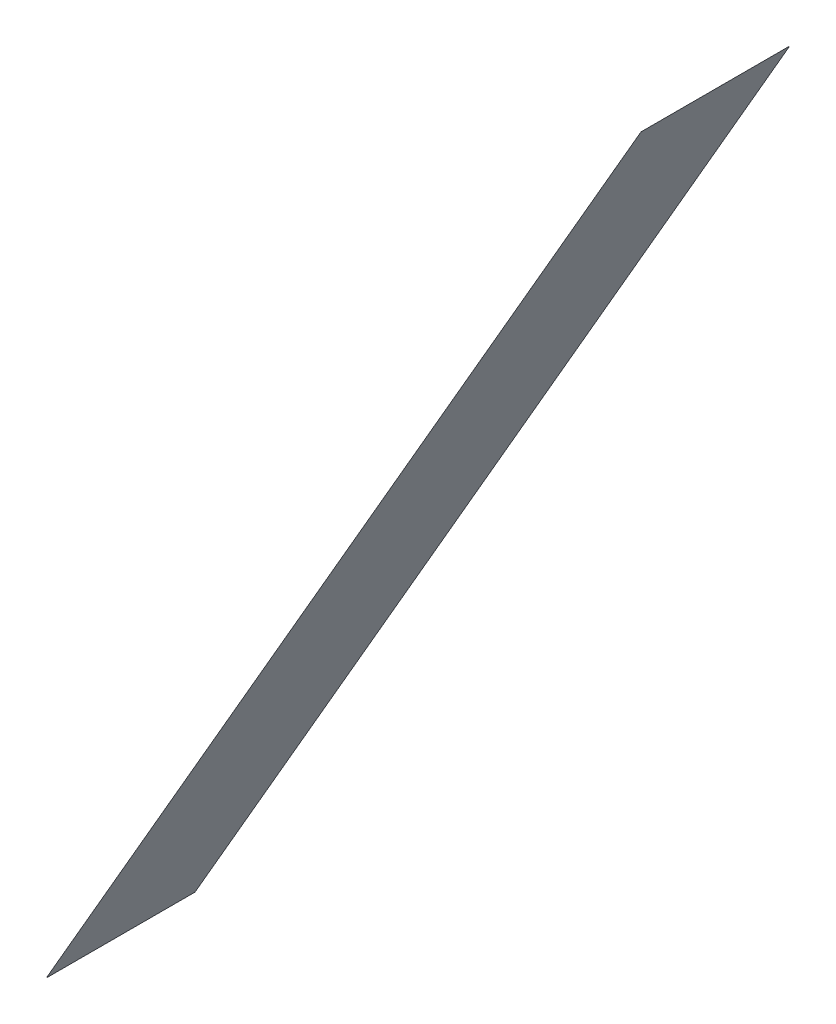
ISO-10303-21;
HEADER;
FILE_DESCRIPTION(('STEP AP214'),'2;1');
FILE_NAME('part.step','',(''),(''),'','','');
FILE_SCHEMA(('AUTOMOTIVE_DESIGN { 1 0 10303 214 1 1 1 1 }'));
ENDSEC;
DATA;
#1=APPLICATION_CONTEXT('core data for automotive mechanical design processes');
#2=APPLICATION_PROTOCOL_DEFINITION('international standard','automotive_design',2000,#1);
#3=PRODUCT_CONTEXT('',#1,'mechanical');
#4=PRODUCT('Part','Part','',(#3));
#5=PRODUCT_RELATED_PRODUCT_CATEGORY('part','',(#4));
#6=PRODUCT_DEFINITION_FORMATION('','',#4);
#7=PRODUCT_DEFINITION_CONTEXT('part definition',#1,'design');
#8=PRODUCT_DEFINITION('design','',#6,#7);
#9=PRODUCT_DEFINITION_SHAPE('','',#8);
#10=(LENGTH_UNIT() NAMED_UNIT(*) SI_UNIT(.MILLI.,.METRE.));
#11=(NAMED_UNIT(*) PLANE_ANGLE_UNIT() SI_UNIT($,.RADIAN.));
#12=(NAMED_UNIT(*) SI_UNIT($,.STERADIAN.) SOLID_ANGLE_UNIT());
#13=UNCERTAINTY_MEASURE_WITH_UNIT(LENGTH_MEASURE(1.E-05),#10,'distance_accuracy_value','');
#14=(GEOMETRIC_REPRESENTATION_CONTEXT(3) GLOBAL_UNCERTAINTY_ASSIGNED_CONTEXT((#13)) GLOBAL_UNIT_ASSIGNED_CONTEXT((#10,
#11,#12)) REPRESENTATION_CONTEXT('',''));
#15=CARTESIAN_POINT('',(0.,0.,0.));
#16=DIRECTION('',(0.,0.,1.));
#17=DIRECTION('',(1.,0.,0.));
#18=AXIS2_PLACEMENT_3D('',#15,#16,#17);
#19=CARTESIAN_POINT('',(198.075577351083,41.076959417664,-265.));
#20=DIRECTION('',(0.,0.,1.));
#21=DIRECTION('',(1.,0.,0.));
#22=AXIS2_PLACEMENT_3D('',#19,#20,#21);
#23=PLANE('',#22);
#24=DIRECTION('',(-0.499999988947861,-0.866025410165394,0.));
#25=VECTOR('',#24,1.);
#26=CARTESIAN_POINT('',(161.247322967488,-14.7115485985014,-265.));
#27=LINE('',#26,#25);
#28=CARTESIAN_POINT('',(204.611518195468,60.3974429793359,-265.));
#29=VERTEX_POINT('',#28);
#30=CARTESIAN_POINT('',(184.611518637553,25.7564265727202,-265.));
#31=VERTEX_POINT('',#30);
#32=EDGE_CURVE('E122',#29,#31,#27,.T.);
#33=ORIENTED_EDGE('',*,*,#32,.T.);
#34=DIRECTION('',(0.866025403784439,-0.5,0.));
#35=VECTOR('',#34,1.);
#36=CARTESIAN_POINT('',(184.611477608081,25.756450261097,-265.));
#37=LINE('',#36,#35);
#38=CARTESIAN_POINT('',(184.611477608081,25.756450261097,-265.));
#39=VERTEX_POINT('',#38);
#40=EDGE_CURVE('E115',#39,#31,#37,.T.);
#41=ORIENTED_EDGE('',*,*,#40,.F.);
#42=DIRECTION('',(-0.5,-0.866025403784439,0.));
#43=VECTOR('',#42,1.);
#44=CARTESIAN_POINT('',(204.611477608081,60.3974664124746,-265.));
#45=LINE('',#44,#43);
#46=CARTESIAN_POINT('',(204.611477608081,60.3974664124746,-265.));
#47=VERTEX_POINT('',#46);
#48=EDGE_CURVE('E106',#47,#39,#45,.T.);
#49=ORIENTED_EDGE('',*,*,#48,.F.);
#50=DIRECTION('',(-0.866025403784439,0.5,0.));
#51=VECTOR('',#50,1.);
#52=CARTESIAN_POINT('',(211.539677094085,56.397468574231,-265.));
#53=LINE('',#52,#51);
#54=EDGE_CURVE('E56',#29,#47,#53,.T.);
#55=ORIENTED_EDGE('',*,*,#54,.F.);
#56=EDGE_LOOP('',(#33,#41,#49,#55));
#57=FACE_BOUND('',#56,.T.);
#58=ADVANCED_FACE('F48',(#57),#23,.F.);
#59=CARTESIAN_POINT('',(198.075577351083,41.076959417664,-260.));
#60=DIRECTION('',(0.,0.,1.));
#61=DIRECTION('',(1.,0.,0.));
#62=AXIS2_PLACEMENT_3D('',#59,#60,#61);
#63=PLANE('',#62);
#64=DIRECTION('',(-0.499999988947861,-0.866025410165394,0.));
#65=VECTOR('',#64,1.);
#66=CARTESIAN_POINT('',(172.179452182066,4.22345519411566,-260.));
#67=LINE('',#66,#65);
#68=CARTESIAN_POINT('',(204.611518195468,60.3974429793359,-260.));
#69=VERTEX_POINT('',#68);
#70=CARTESIAN_POINT('',(184.611518637553,25.7564265727202,-260.));
#71=VERTEX_POINT('',#70);
#72=EDGE_CURVE('E143',#69,#71,#67,.T.);
#73=ORIENTED_EDGE('',*,*,#72,.F.);
#74=DIRECTION('',(-0.866025403784439,0.5,0.));
#75=VECTOR('',#74,1.);
#76=CARTESIAN_POINT('',(211.539677094085,56.397468574231,-260.));
#77=LINE('',#76,#75);
#78=CARTESIAN_POINT('',(204.611477608081,60.3974664124746,-260.));
#79=VERTEX_POINT('',#78);
#80=EDGE_CURVE('E11',#69,#79,#77,.T.);
#81=ORIENTED_EDGE('',*,*,#80,.T.);
#82=DIRECTION('',(-0.5,-0.866025403784439,0.));
#83=VECTOR('',#82,1.);
#84=CARTESIAN_POINT('',(204.611477608081,60.3974664124746,-260.));
#85=LINE('',#84,#83);
#86=CARTESIAN_POINT('',(184.611477608081,25.756450261097,-260.));
#87=VERTEX_POINT('',#86);
#88=EDGE_CURVE('E97',#79,#87,#85,.T.);
#89=ORIENTED_EDGE('',*,*,#88,.T.);
#90=DIRECTION('',(0.866025403784439,-0.5,0.));
#91=VECTOR('',#90,1.);
#92=CARTESIAN_POINT('',(184.611477608081,25.756450261097,-260.));
#93=LINE('',#92,#91);
#94=EDGE_CURVE('E101',#87,#71,#93,.T.);
#95=ORIENTED_EDGE('',*,*,#94,.T.);
#96=EDGE_LOOP('',(#73,#81,#89,#95));
#97=FACE_BOUND('',#96,.T.);
#98=ADVANCED_FACE('F99',(#97),#63,.T.);
#99=CARTESIAN_POINT('',(211.539677094085,56.397468574231,-265.));
#100=DIRECTION('',(0.5,0.866025403784438,0.));
#101=DIRECTION('',(0.,0.,-1.));
#102=AXIS2_PLACEMENT_3D('',#99,#100,#101);
#103=PLANE('',#102);
#104=DIRECTION('',(0.,0.,-1.));
#105=VECTOR('',#104,1.);
#106=CARTESIAN_POINT('',(204.611518195468,60.397442979336,-163.75));
#107=LINE('',#106,#105);
#108=EDGE_CURVE('E147',#69,#29,#107,.T.);
#109=ORIENTED_EDGE('',*,*,#108,.T.);
#110=ORIENTED_EDGE('',*,*,#54,.T.);
#111=DIRECTION('',(0.,0.,1.));
#112=VECTOR('',#111,1.);
#113=CARTESIAN_POINT('',(204.611477608081,60.3974664124746,-265.));
#114=LINE('',#113,#112);
#115=EDGE_CURVE('E105',#47,#79,#114,.T.);
#116=ORIENTED_EDGE('',*,*,#115,.T.);
#117=ORIENTED_EDGE('',*,*,#80,.F.);
#118=EDGE_LOOP('',(#109,#110,#116,#117));
#119=FACE_BOUND('',#118,.T.);
#120=ADVANCED_FACE('F137',(#119),#103,.T.);
#121=CARTESIAN_POINT('',(204.611477608081,60.3974664124746,-265.));
#122=DIRECTION('',(-0.866025403784438,0.5,0.));
#123=DIRECTION('',(0.,0.,1.));
#124=AXIS2_PLACEMENT_3D('',#121,#122,#123);
#125=PLANE('',#124);
#126=ORIENTED_EDGE('',*,*,#48,.T.);
#127=DIRECTION('',(0.,0.,1.));
#128=VECTOR('',#127,1.);
#129=CARTESIAN_POINT('',(184.611477608081,25.756450261097,-265.));
#130=LINE('',#129,#128);
#131=EDGE_CURVE('E109',#39,#87,#130,.T.);
#132=ORIENTED_EDGE('',*,*,#131,.T.);
#133=ORIENTED_EDGE('',*,*,#88,.F.);
#134=ORIENTED_EDGE('',*,*,#115,.F.);
#135=EDGE_LOOP('',(#126,#132,#133,#134));
#136=FACE_BOUND('',#135,.T.);
#137=ADVANCED_FACE('F110',(#136),#125,.T.);
#138=CARTESIAN_POINT('',(184.611477608081,25.756450261097,-265.));
#139=DIRECTION('',(-0.5,-0.866025403784438,0.));
#140=DIRECTION('',(-0.866025403784438,0.5,0.));
#141=AXIS2_PLACEMENT_3D('',#138,#139,#140);
#142=PLANE('',#141);
#143=DIRECTION('',(0.,0.,1.));
#144=VECTOR('',#143,1.);
#145=CARTESIAN_POINT('',(184.611518637553,25.7564265727202,-163.75));
#146=LINE('',#145,#144);
#147=EDGE_CURVE('E119',#31,#71,#146,.T.);
#148=ORIENTED_EDGE('',*,*,#147,.T.);
#149=ORIENTED_EDGE('',*,*,#94,.F.);
#150=ORIENTED_EDGE('',*,*,#131,.F.);
#151=ORIENTED_EDGE('',*,*,#40,.T.);
#152=EDGE_LOOP('',(#148,#149,#150,#151));
#153=FACE_BOUND('',#152,.T.);
#154=ADVANCED_FACE('F117',(#153),#142,.T.);
#155=CARTESIAN_POINT('',(127.883127543988,-72.5000319288229,-62.5));
#156=DIRECTION('',(-0.866025410165394,0.499999988947861,0.));
#157=DIRECTION('',(0.,0.,1.));
#158=AXIS2_PLACEMENT_3D('',#155,#156,#157);
#159=PLANE('',#158);
#160=ORIENTED_EDGE('',*,*,#108,.F.);
#161=ORIENTED_EDGE('',*,*,#72,.T.);
#162=ORIENTED_EDGE('',*,*,#147,.F.);
#163=ORIENTED_EDGE('',*,*,#32,.F.);
#164=EDGE_LOOP('',(#160,#161,#162,#163));
#165=FACE_BOUND('',#164,.T.);
#166=ADVANCED_FACE('F142',(#165),#159,.F.);
#167=CLOSED_SHELL('',(#58,#98,#120,#137,#154,#166));
#168=MANIFOLD_SOLID_BREP('B2',#167);
#169=ADVANCED_BREP_SHAPE_REPRESENTATION('',(#18,#168),#14);
#170=SHAPE_DEFINITION_REPRESENTATION(#9,#169);
ENDSEC;
END-ISO-10303-21;
